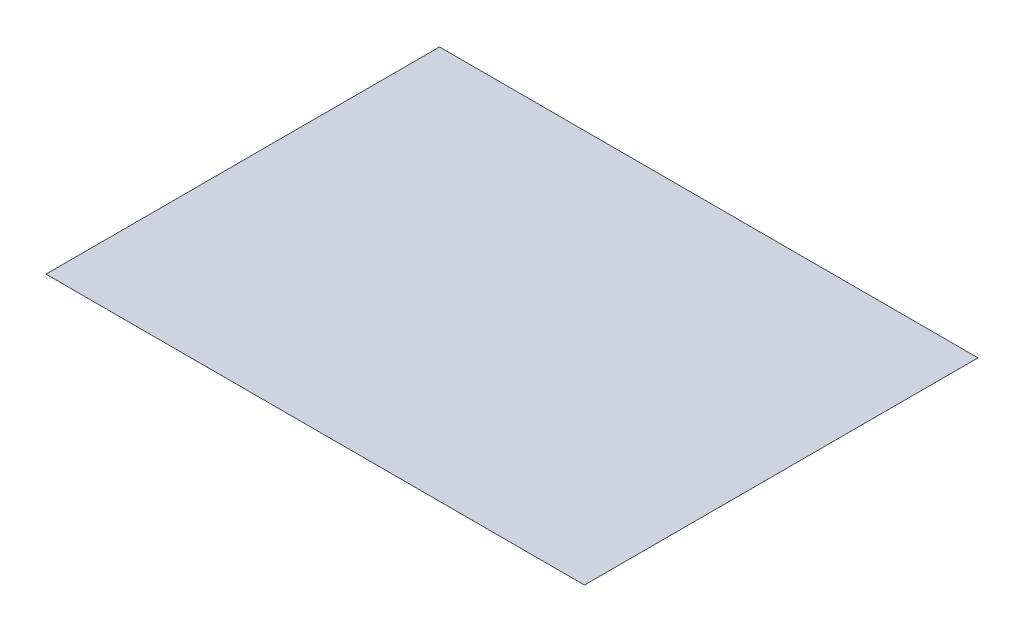
ISO-10303-21;
HEADER;
FILE_DESCRIPTION(('STEP AP214'),'2;1');
FILE_NAME('part.step','',(''),(''),'','','');
FILE_SCHEMA(('AUTOMOTIVE_DESIGN { 1 0 10303 214 1 1 1 1 }'));
ENDSEC;
DATA;
#1=APPLICATION_CONTEXT('core data for automotive mechanical design processes');
#2=APPLICATION_PROTOCOL_DEFINITION('international standard','automotive_design',2000,#1);
#3=PRODUCT_CONTEXT('',#1,'mechanical');
#4=PRODUCT('Part','Part','',(#3));
#5=PRODUCT_RELATED_PRODUCT_CATEGORY('part','',(#4));
#6=PRODUCT_DEFINITION_FORMATION('','',#4);
#7=PRODUCT_DEFINITION_CONTEXT('part definition',#1,'design');
#8=PRODUCT_DEFINITION('design','',#6,#7);
#9=PRODUCT_DEFINITION_SHAPE('','',#8);
#10=(LENGTH_UNIT() NAMED_UNIT(*) SI_UNIT(.MILLI.,.METRE.));
#11=(NAMED_UNIT(*) PLANE_ANGLE_UNIT() SI_UNIT($,.RADIAN.));
#12=(NAMED_UNIT(*) SI_UNIT($,.STERADIAN.) SOLID_ANGLE_UNIT());
#13=UNCERTAINTY_MEASURE_WITH_UNIT(LENGTH_MEASURE(1.E-05),#10,'distance_accuracy_value','');
#14=(GEOMETRIC_REPRESENTATION_CONTEXT(3) GLOBAL_UNCERTAINTY_ASSIGNED_CONTEXT((#13)) GLOBAL_UNIT_ASSIGNED_CONTEXT((#10,
#11,#12)) REPRESENTATION_CONTEXT('',''));
#15=CARTESIAN_POINT('',(0.,0.,0.));
#16=DIRECTION('',(0.,0.,1.));
#17=DIRECTION('',(1.,0.,0.));
#18=AXIS2_PLACEMENT_3D('',#15,#16,#17);
#19=CARTESIAN_POINT('',(-65.,0.005,47.5));
#20=DIRECTION('',(1.,0.,0.));
#21=DIRECTION('',(0.,0.,-1.));
#22=AXIS2_PLACEMENT_3D('',#19,#20,#21);
#23=PLANE('',#22);
#24=DIRECTION('',(0.,0.,1.));
#25=VECTOR('',#24,1.);
#26=CARTESIAN_POINT('',(-65.,0.,47.5));
#27=LINE('',#26,#25);
#28=CARTESIAN_POINT('',(-65.,0.,-47.5));
#29=VERTEX_POINT('',#28);
#30=CARTESIAN_POINT('',(-65.,0.,47.5));
#31=VERTEX_POINT('',#30);
#32=EDGE_CURVE('E96',#29,#31,#27,.T.);
#33=ORIENTED_EDGE('',*,*,#32,.T.);
#34=DIRECTION('',(0.,-1.,0.));
#35=VECTOR('',#34,1.);
#36=CARTESIAN_POINT('',(-65.,0.005,47.5));
#37=LINE('',#36,#35);
#38=CARTESIAN_POINT('',(-65.,0.005,47.5));
#39=VERTEX_POINT('',#38);
#40=EDGE_CURVE('E11',#39,#31,#37,.T.);
#41=ORIENTED_EDGE('',*,*,#40,.F.);
#42=DIRECTION('',(0.,0.,1.));
#43=VECTOR('',#42,1.);
#44=CARTESIAN_POINT('',(-65.,0.005,47.5));
#45=LINE('',#44,#43);
#46=CARTESIAN_POINT('',(-65.,0.005,-47.5));
#47=VERTEX_POINT('',#46);
#48=EDGE_CURVE('E84',#47,#39,#45,.T.);
#49=ORIENTED_EDGE('',*,*,#48,.F.);
#50=DIRECTION('',(0.,-1.,0.));
#51=VECTOR('',#50,1.);
#52=CARTESIAN_POINT('',(-65.,0.005,-47.5));
#53=LINE('',#52,#51);
#54=EDGE_CURVE('E92',#47,#29,#53,.T.);
#55=ORIENTED_EDGE('',*,*,#54,.T.);
#56=EDGE_LOOP('',(#33,#41,#49,#55));
#57=FACE_BOUND('',#56,.T.);
#58=ADVANCED_FACE('F33',(#57),#23,.F.);
#59=CARTESIAN_POINT('',(65.,0.005,47.5));
#60=DIRECTION('',(0.,0.,-1.));
#61=DIRECTION('',(-1.,0.,0.));
#62=AXIS2_PLACEMENT_3D('',#59,#60,#61);
#63=PLANE('',#62);
#64=DIRECTION('',(1.,0.,0.));
#65=VECTOR('',#64,1.);
#66=CARTESIAN_POINT('',(65.,0.,47.5));
#67=LINE('',#66,#65);
#68=CARTESIAN_POINT('',(65.,0.,47.5));
#69=VERTEX_POINT('',#68);
#70=EDGE_CURVE('E88',#31,#69,#67,.T.);
#71=ORIENTED_EDGE('',*,*,#70,.T.);
#72=DIRECTION('',(0.,-1.,0.));
#73=VECTOR('',#72,1.);
#74=CARTESIAN_POINT('',(65.,0.005,47.5));
#75=LINE('',#74,#73);
#76=CARTESIAN_POINT('',(65.,0.005,47.5));
#77=VERTEX_POINT('',#76);
#78=EDGE_CURVE('E41',#77,#69,#75,.T.);
#79=ORIENTED_EDGE('',*,*,#78,.F.);
#80=DIRECTION('',(1.,0.,0.));
#81=VECTOR('',#80,1.);
#82=CARTESIAN_POINT('',(65.,0.005,47.5));
#83=LINE('',#82,#81);
#84=EDGE_CURVE('E79',#39,#77,#83,.T.);
#85=ORIENTED_EDGE('',*,*,#84,.F.);
#86=ORIENTED_EDGE('',*,*,#40,.T.);
#87=EDGE_LOOP('',(#71,#79,#85,#86));
#88=FACE_BOUND('',#87,.T.);
#89=ADVANCED_FACE('F87',(#88),#63,.F.);
#90=CARTESIAN_POINT('',(65.,0.005,47.5));
#91=DIRECTION('',(-1.,0.,0.));
#92=DIRECTION('',(0.,0.,1.));
#93=AXIS2_PLACEMENT_3D('',#90,#91,#92);
#94=PLANE('',#93);
#95=DIRECTION('',(0.,0.,-1.));
#96=VECTOR('',#95,1.);
#97=CARTESIAN_POINT('',(65.,0.,47.5));
#98=LINE('',#97,#96);
#99=CARTESIAN_POINT('',(65.,0.,-47.5));
#100=VERTEX_POINT('',#99);
#101=EDGE_CURVE('E66',#69,#100,#98,.T.);
#102=ORIENTED_EDGE('',*,*,#101,.T.);
#103=DIRECTION('',(0.,-1.,0.));
#104=VECTOR('',#103,1.);
#105=CARTESIAN_POINT('',(65.,0.005,-47.5));
#106=LINE('',#105,#104);
#107=CARTESIAN_POINT('',(65.,0.005,-47.5));
#108=VERTEX_POINT('',#107);
#109=EDGE_CURVE('E89',#108,#100,#106,.T.);
#110=ORIENTED_EDGE('',*,*,#109,.F.);
#111=DIRECTION('',(0.,0.,-1.));
#112=VECTOR('',#111,1.);
#113=CARTESIAN_POINT('',(65.,0.005,47.5));
#114=LINE('',#113,#112);
#115=EDGE_CURVE('E82',#77,#108,#114,.T.);
#116=ORIENTED_EDGE('',*,*,#115,.F.);
#117=ORIENTED_EDGE('',*,*,#78,.T.);
#118=EDGE_LOOP('',(#102,#110,#116,#117));
#119=FACE_BOUND('',#118,.T.);
#120=ADVANCED_FACE('F90',(#119),#94,.F.);
#121=CARTESIAN_POINT('',(65.,0.005,-47.5));
#122=DIRECTION('',(0.,0.,1.));
#123=DIRECTION('',(1.,0.,0.));
#124=AXIS2_PLACEMENT_3D('',#121,#122,#123);
#125=PLANE('',#124);
#126=DIRECTION('',(-1.,0.,0.));
#127=VECTOR('',#126,1.);
#128=CARTESIAN_POINT('',(65.,0.,-47.5));
#129=LINE('',#128,#127);
#130=EDGE_CURVE('E72',#100,#29,#129,.T.);
#131=ORIENTED_EDGE('',*,*,#130,.T.);
#132=ORIENTED_EDGE('',*,*,#54,.F.);
#133=DIRECTION('',(-1.,0.,0.));
#134=VECTOR('',#133,1.);
#135=CARTESIAN_POINT('',(65.,0.005,-47.5));
#136=LINE('',#135,#134);
#137=EDGE_CURVE('E49',#108,#47,#136,.T.);
#138=ORIENTED_EDGE('',*,*,#137,.F.);
#139=ORIENTED_EDGE('',*,*,#109,.T.);
#140=EDGE_LOOP('',(#131,#132,#138,#139));
#141=FACE_BOUND('',#140,.T.);
#142=ADVANCED_FACE('F103',(#141),#125,.F.);
#143=CARTESIAN_POINT('',(0.,0.005,0.));
#144=DIRECTION('',(0.,1.,0.));
#145=DIRECTION('',(0.,0.,1.));
#146=AXIS2_PLACEMENT_3D('',#143,#144,#145);
#147=PLANE('',#146);
#148=ORIENTED_EDGE('',*,*,#48,.T.);
#149=ORIENTED_EDGE('',*,*,#84,.T.);
#150=ORIENTED_EDGE('',*,*,#115,.T.);
#151=ORIENTED_EDGE('',*,*,#137,.T.);
#152=EDGE_LOOP('',(#148,#149,#150,#151));
#153=FACE_BOUND('',#152,.T.);
#154=ADVANCED_FACE('F80',(#153),#147,.T.);
#155=CARTESIAN_POINT('',(0.,0.,0.));
#156=DIRECTION('',(0.,1.,0.));
#157=DIRECTION('',(0.,0.,1.));
#158=AXIS2_PLACEMENT_3D('',#155,#156,#157);
#159=PLANE('',#158);
#160=ORIENTED_EDGE('',*,*,#32,.F.);
#161=ORIENTED_EDGE('',*,*,#130,.F.);
#162=ORIENTED_EDGE('',*,*,#101,.F.);
#163=ORIENTED_EDGE('',*,*,#70,.F.);
#164=EDGE_LOOP('',(#160,#161,#162,#163));
#165=FACE_BOUND('',#164,.T.);
#166=ADVANCED_FACE('F106',(#165),#159,.F.);
#167=CLOSED_SHELL('',(#58,#89,#120,#142,#154,#166));
#168=MANIFOLD_SOLID_BREP('B2',#167);
#169=ADVANCED_BREP_SHAPE_REPRESENTATION('',(#18,#168),#14);
#170=SHAPE_DEFINITION_REPRESENTATION(#9,#169);
ENDSEC;
END-ISO-10303-21;
